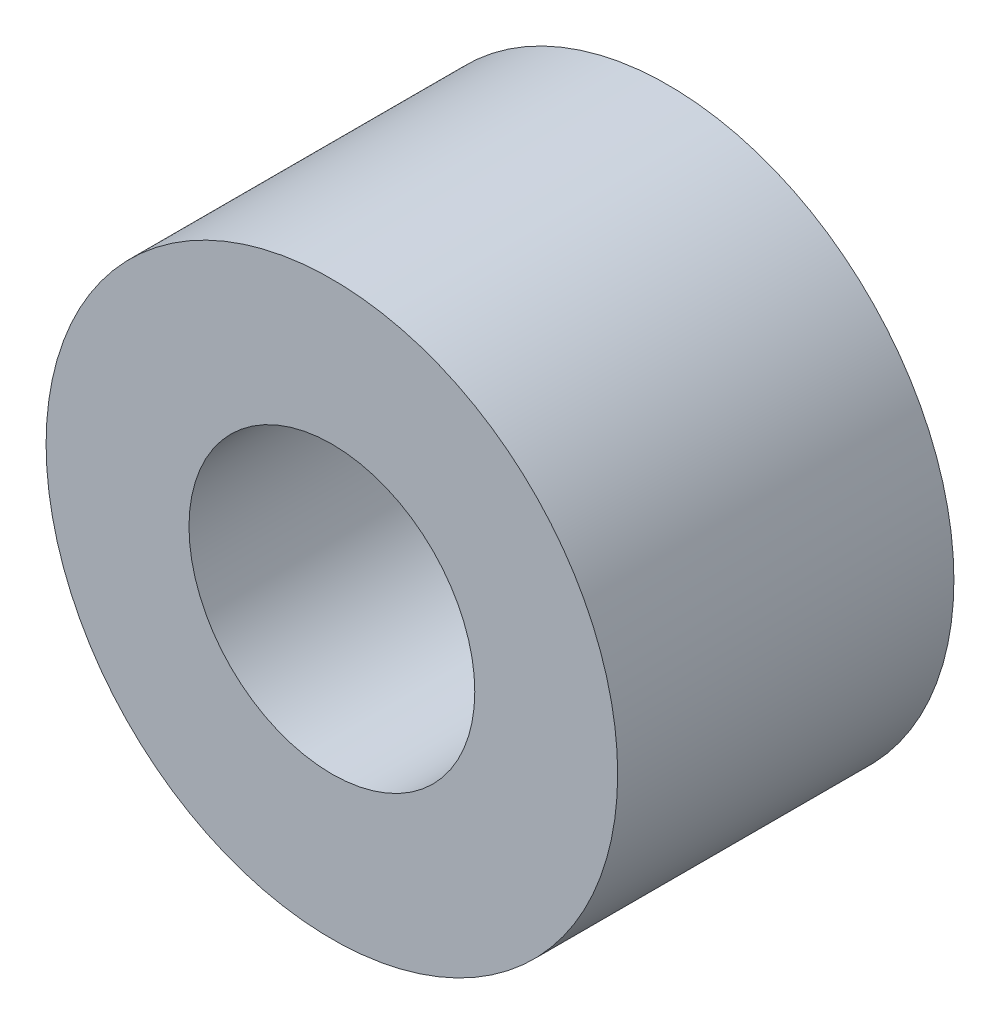
ISO-10303-21;
HEADER;
FILE_DESCRIPTION(('STEP AP214'),'2;1');
FILE_NAME('part.step','',(''),(''),'','','');
FILE_SCHEMA(('AUTOMOTIVE_DESIGN { 1 0 10303 214 1 1 1 1 }'));
ENDSEC;
DATA;
#1=APPLICATION_CONTEXT('core data for automotive mechanical design processes');
#2=APPLICATION_PROTOCOL_DEFINITION('international standard','automotive_design',2000,#1);
#3=PRODUCT_CONTEXT('',#1,'mechanical');
#4=PRODUCT('Part','Part','',(#3));
#5=PRODUCT_RELATED_PRODUCT_CATEGORY('part','',(#4));
#6=PRODUCT_DEFINITION_FORMATION('','',#4);
#7=PRODUCT_DEFINITION_CONTEXT('part definition',#1,'design');
#8=PRODUCT_DEFINITION('design','',#6,#7);
#9=PRODUCT_DEFINITION_SHAPE('','',#8);
#10=(LENGTH_UNIT() NAMED_UNIT(*) SI_UNIT(.MILLI.,.METRE.));
#11=(NAMED_UNIT(*) PLANE_ANGLE_UNIT() SI_UNIT($,.RADIAN.));
#12=(NAMED_UNIT(*) SI_UNIT($,.STERADIAN.) SOLID_ANGLE_UNIT());
#13=UNCERTAINTY_MEASURE_WITH_UNIT(LENGTH_MEASURE(1.E-05),#10,'distance_accuracy_value','');
#14=(GEOMETRIC_REPRESENTATION_CONTEXT(3) GLOBAL_UNCERTAINTY_ASSIGNED_CONTEXT((#13)) GLOBAL_UNIT_ASSIGNED_CONTEXT((#10,
#11,#12)) REPRESENTATION_CONTEXT('',''));
#15=CARTESIAN_POINT('',(0.,0.,0.));
#16=DIRECTION('',(0.,0.,1.));
#17=DIRECTION('',(1.,0.,0.));
#18=AXIS2_PLACEMENT_3D('',#15,#16,#17);
#19=CARTESIAN_POINT('',(0.,0.,10.));
#20=DIRECTION('',(0.,0.,1.));
#21=DIRECTION('',(1.,0.,0.));
#22=AXIS2_PLACEMENT_3D('',#19,#20,#21);
#23=PLANE('',#22);
#24=CARTESIAN_POINT('',(0.,0.,10.));
#25=DIRECTION('',(0.,0.,1.));
#26=DIRECTION('',(1.,0.,0.));
#27=AXIS2_PLACEMENT_3D('',#24,#25,#26);
#28=CIRCLE('',#27,8.5);
#29=CARTESIAN_POINT('',(8.5,0.,10.));
#30=VERTEX_POINT('',#29);
#31=EDGE_CURVE('E10',#30,#30,#28,.T.);
#32=ORIENTED_EDGE('',*,*,#31,.T.);
#33=EDGE_LOOP('',(#32));
#34=FACE_BOUND('',#33,.T.);
#35=CARTESIAN_POINT('',(0.,0.,10.));
#36=DIRECTION('',(0.,0.,1.));
#37=DIRECTION('',(1.,0.,0.));
#38=AXIS2_PLACEMENT_3D('',#35,#36,#37);
#39=CIRCLE('',#38,4.25);
#40=CARTESIAN_POINT('',(4.25,0.,10.));
#41=VERTEX_POINT('',#40);
#42=EDGE_CURVE('E42',#41,#41,#39,.T.);
#43=ORIENTED_EDGE('',*,*,#42,.F.);
#44=EDGE_LOOP('',(#43));
#45=FACE_BOUND('',#44,.T.);
#46=ADVANCED_FACE('F31',(#34,#45),#23,.T.);
#47=CARTESIAN_POINT('',(0.,0.,0.));
#48=DIRECTION('',(0.,0.,1.));
#49=DIRECTION('',(1.,0.,0.));
#50=AXIS2_PLACEMENT_3D('',#47,#48,#49);
#51=PLANE('',#50);
#52=CARTESIAN_POINT('',(0.,0.,0.));
#53=DIRECTION('',(0.,0.,1.));
#54=DIRECTION('',(1.,0.,0.));
#55=AXIS2_PLACEMENT_3D('',#52,#53,#54);
#56=CIRCLE('',#55,8.5);
#57=CARTESIAN_POINT('',(8.5,0.,0.));
#58=VERTEX_POINT('',#57);
#59=EDGE_CURVE('E35',#58,#58,#56,.T.);
#60=ORIENTED_EDGE('',*,*,#59,.F.);
#61=EDGE_LOOP('',(#60));
#62=FACE_BOUND('',#61,.T.);
#63=CARTESIAN_POINT('',(0.,0.,0.));
#64=DIRECTION('',(0.,0.,1.));
#65=DIRECTION('',(1.,0.,0.));
#66=AXIS2_PLACEMENT_3D('',#63,#64,#65);
#67=CIRCLE('',#66,4.25);
#68=CARTESIAN_POINT('',(4.25,0.,0.));
#69=VERTEX_POINT('',#68);
#70=EDGE_CURVE('E44',#69,#69,#67,.T.);
#71=ORIENTED_EDGE('',*,*,#70,.T.);
#72=EDGE_LOOP('',(#71));
#73=FACE_BOUND('',#72,.T.);
#74=ADVANCED_FACE('F54',(#62,#73),#51,.F.);
#75=CARTESIAN_POINT('',(0.,0.,10.));
#76=DIRECTION('',(0.,0.,-1.));
#77=DIRECTION('',(-1.,0.,0.));
#78=AXIS2_PLACEMENT_3D('',#75,#76,#77);
#79=CYLINDRICAL_SURFACE('',#78,8.5);
#80=ORIENTED_EDGE('',*,*,#31,.F.);
#81=EDGE_LOOP('',(#80));
#82=FACE_BOUND('',#81,.T.);
#83=ORIENTED_EDGE('',*,*,#59,.T.);
#84=EDGE_LOOP('',(#83));
#85=FACE_BOUND('',#84,.T.);
#86=ADVANCED_FACE('F33',(#82,#85),#79,.T.);
#87=CARTESIAN_POINT('',(0.,0.,10.));
#88=DIRECTION('',(0.,0.,-1.));
#89=DIRECTION('',(-1.,0.,0.));
#90=AXIS2_PLACEMENT_3D('',#87,#88,#89);
#91=CYLINDRICAL_SURFACE('',#90,4.25);
#92=ORIENTED_EDGE('',*,*,#42,.T.);
#93=EDGE_LOOP('',(#92));
#94=FACE_BOUND('',#93,.T.);
#95=ORIENTED_EDGE('',*,*,#70,.F.);
#96=EDGE_LOOP('',(#95));
#97=FACE_BOUND('',#96,.T.);
#98=ADVANCED_FACE('F50',(#94,#97),#91,.F.);
#99=CLOSED_SHELL('',(#46,#74,#86,#98));
#100=MANIFOLD_SOLID_BREP('B2',#99);
#101=ADVANCED_BREP_SHAPE_REPRESENTATION('',(#18,#100),#14);
#102=SHAPE_DEFINITION_REPRESENTATION(#9,#101);
ENDSEC;
END-ISO-10303-21;
